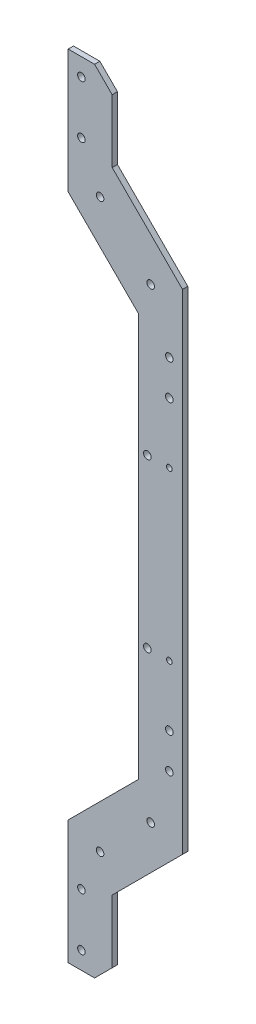
ISO-10303-21;
HEADER;
FILE_DESCRIPTION(('STEP AP214'),'2;1');
FILE_NAME('part.step','',(''),(''),'','','');
FILE_SCHEMA(('AUTOMOTIVE_DESIGN { 1 0 10303 214 1 1 1 1 }'));
ENDSEC;
DATA;
#1=APPLICATION_CONTEXT('core data for automotive mechanical design processes');
#2=APPLICATION_PROTOCOL_DEFINITION('international standard','automotive_design',2000,#1);
#3=PRODUCT_CONTEXT('',#1,'mechanical');
#4=PRODUCT('Part','Part','',(#3));
#5=PRODUCT_RELATED_PRODUCT_CATEGORY('part','',(#4));
#6=PRODUCT_DEFINITION_FORMATION('','',#4);
#7=PRODUCT_DEFINITION_CONTEXT('part definition',#1,'design');
#8=PRODUCT_DEFINITION('design','',#6,#7);
#9=PRODUCT_DEFINITION_SHAPE('','',#8);
#10=(LENGTH_UNIT() NAMED_UNIT(*) SI_UNIT(.MILLI.,.METRE.));
#11=(NAMED_UNIT(*) PLANE_ANGLE_UNIT() SI_UNIT($,.RADIAN.));
#12=(NAMED_UNIT(*) SI_UNIT($,.STERADIAN.) SOLID_ANGLE_UNIT());
#13=UNCERTAINTY_MEASURE_WITH_UNIT(LENGTH_MEASURE(1.E-05),#10,'distance_accuracy_value','');
#14=(GEOMETRIC_REPRESENTATION_CONTEXT(3) GLOBAL_UNCERTAINTY_ASSIGNED_CONTEXT((#13)) GLOBAL_UNIT_ASSIGNED_CONTEXT((#10,
#11,#12)) REPRESENTATION_CONTEXT('',''));
#15=CARTESIAN_POINT('',(0.,0.,0.));
#16=DIRECTION('',(0.,0.,1.));
#17=DIRECTION('',(1.,0.,0.));
#18=AXIS2_PLACEMENT_3D('',#15,#16,#17);
#19=CARTESIAN_POINT('',(0.,-224.999999999947,3.));
#20=DIRECTION('',(0.,1.,0.));
#21=DIRECTION('',(0.,0.,1.));
#22=AXIS2_PLACEMENT_3D('',#19,#20,#21);
#23=PLANE('',#22);
#24=DIRECTION('',(1.,0.,0.));
#25=VECTOR('',#24,1.);
#26=CARTESIAN_POINT('',(0.,-224.999999999947,0.));
#27=LINE('',#26,#25);
#28=CARTESIAN_POINT('',(-372.700177836843,-224.999999999947,0.));
#29=VERTEX_POINT('',#28);
#30=CARTESIAN_POINT('',(-357.700177836843,-224.999999999947,0.));
#31=VERTEX_POINT('',#30);
#32=EDGE_CURVE('E150',#29,#31,#27,.T.);
#33=ORIENTED_EDGE('',*,*,#32,.T.);
#34=DIRECTION('',(0.,0.,1.));
#35=VECTOR('',#34,1.);
#36=CARTESIAN_POINT('',(-357.700177836843,-224.999999999947,3.));
#37=LINE('',#36,#35);
#38=CARTESIAN_POINT('',(-357.700177836843,-224.999999999947,3.));
#39=VERTEX_POINT('',#38);
#40=EDGE_CURVE('E250',#31,#39,#37,.T.);
#41=ORIENTED_EDGE('',*,*,#40,.T.);
#42=DIRECTION('',(1.,0.,0.));
#43=VECTOR('',#42,1.);
#44=CARTESIAN_POINT('',(0.,-224.999999999947,3.));
#45=LINE('',#44,#43);
#46=CARTESIAN_POINT('',(-372.700177836843,-224.999999999947,3.));
#47=VERTEX_POINT('',#46);
#48=EDGE_CURVE('E154',#47,#39,#45,.T.);
#49=ORIENTED_EDGE('',*,*,#48,.F.);
#50=DIRECTION('',(0.,0.,-1.));
#51=VECTOR('',#50,1.);
#52=CARTESIAN_POINT('',(-372.700177836843,-224.999999999947,3.));
#53=LINE('',#52,#51);
#54=EDGE_CURVE('E209',#47,#29,#53,.T.);
#55=ORIENTED_EDGE('',*,*,#54,.T.);
#56=EDGE_LOOP('',(#33,#41,#49,#55));
#57=FACE_BOUND('',#56,.T.);
#58=ADVANCED_FACE('F40',(#57),#23,.F.);
#59=CARTESIAN_POINT('',(-347.700177836843,-4.20892630251318E-13,3.));
#60=DIRECTION('',(-1.,0.,0.));
#61=DIRECTION('',(0.,-1.,0.));
#62=AXIS2_PLACEMENT_3D('',#59,#60,#61);
#63=PLANE('',#62);
#64=DIRECTION('',(0.,1.,0.));
#65=VECTOR('',#64,1.);
#66=CARTESIAN_POINT('',(-347.700177836843,-4.20892630251318E-13,3.));
#67=LINE('',#66,#65);
#68=CARTESIAN_POINT('',(-347.700177836843,-214.999999999947,3.));
#69=VERTEX_POINT('',#68);
#70=CARTESIAN_POINT('',(-347.700177836843,-179.142135623678,3.));
#71=VERTEX_POINT('',#70);
#72=EDGE_CURVE('E190',#69,#71,#67,.T.);
#73=ORIENTED_EDGE('',*,*,#72,.F.);
#74=DIRECTION('',(0.,0.,-1.));
#75=VECTOR('',#74,1.);
#76=CARTESIAN_POINT('',(-347.700177836843,-214.999999999947,3.));
#77=LINE('',#76,#75);
#78=CARTESIAN_POINT('',(-347.700177836843,-214.999999999947,0.));
#79=VERTEX_POINT('',#78);
#80=EDGE_CURVE('E243',#69,#79,#77,.T.);
#81=ORIENTED_EDGE('',*,*,#80,.T.);
#82=DIRECTION('',(0.,1.,0.));
#83=VECTOR('',#82,1.);
#84=CARTESIAN_POINT('',(-347.700177836843,-4.20892630251318E-13,0.));
#85=LINE('',#84,#83);
#86=CARTESIAN_POINT('',(-347.700177836843,-179.142135623678,0.));
#87=VERTEX_POINT('',#86);
#88=EDGE_CURVE('E211',#79,#87,#85,.T.);
#89=ORIENTED_EDGE('',*,*,#88,.T.);
#90=DIRECTION('',(0.,0.,-1.));
#91=VECTOR('',#90,1.);
#92=CARTESIAN_POINT('',(-347.700177836843,-179.142135623678,3.));
#93=LINE('',#92,#91);
#94=EDGE_CURVE('E240',#71,#87,#93,.T.);
#95=ORIENTED_EDGE('',*,*,#94,.F.);
#96=EDGE_LOOP('',(#73,#81,#89,#95));
#97=FACE_BOUND('',#96,.T.);
#98=ADVANCED_FACE('F289',(#97),#63,.F.);
#99=CARTESIAN_POINT('',(-84.279021106582,84.2790211065823,3.));
#100=DIRECTION('',(-0.707106781186546,0.707106781186548,0.));
#101=DIRECTION('',(-0.707106781186549,-0.707106781186546,0.));
#102=AXIS2_PLACEMENT_3D('',#99,#100,#101);
#103=PLANE('',#102);
#104=DIRECTION('',(0.707106781186549,0.707106781186546,0.));
#105=VECTOR('',#104,1.);
#106=CARTESIAN_POINT('',(-84.279021106582,84.2790211065823,0.));
#107=LINE('',#106,#105);
#108=CARTESIAN_POINT('',(-307.700177836843,-139.142135623678,0.));
#109=VERTEX_POINT('',#108);
#110=EDGE_CURVE('E213',#87,#109,#107,.T.);
#111=ORIENTED_EDGE('',*,*,#110,.T.);
#112=DIRECTION('',(0.,0.,-1.));
#113=VECTOR('',#112,1.);
#114=CARTESIAN_POINT('',(-307.700177836843,-139.142135623678,3.));
#115=LINE('',#114,#113);
#116=CARTESIAN_POINT('',(-307.700177836843,-139.142135623678,3.));
#117=VERTEX_POINT('',#116);
#118=EDGE_CURVE('E237',#117,#109,#115,.T.);
#119=ORIENTED_EDGE('',*,*,#118,.F.);
#120=DIRECTION('',(0.707106781186549,0.707106781186546,0.));
#121=VECTOR('',#120,1.);
#122=CARTESIAN_POINT('',(-84.279021106582,84.2790211065823,3.));
#123=LINE('',#122,#121);
#124=EDGE_CURVE('E192',#71,#117,#123,.T.);
#125=ORIENTED_EDGE('',*,*,#124,.F.);
#126=ORIENTED_EDGE('',*,*,#94,.T.);
#127=EDGE_LOOP('',(#111,#119,#125,#126));
#128=FACE_BOUND('',#127,.T.);
#129=ADVANCED_FACE('F295',(#128),#103,.F.);
#130=CARTESIAN_POINT('',(-307.700177836842,2.41558864378642E-12,3.));
#131=DIRECTION('',(-1.,0.,0.));
#132=DIRECTION('',(0.,-1.,0.));
#133=AXIS2_PLACEMENT_3D('',#130,#131,#132);
#134=PLANE('',#133);
#135=DIRECTION('',(0.,1.,0.));
#136=VECTOR('',#135,1.);
#137=CARTESIAN_POINT('',(-307.700177836842,2.41558864378642E-12,0.));
#138=LINE('',#137,#136);
#139=CARTESIAN_POINT('',(-307.700177836843,139.142135623678,0.));
#140=VERTEX_POINT('',#139);
#141=EDGE_CURVE('E215',#109,#140,#138,.T.);
#142=ORIENTED_EDGE('',*,*,#141,.T.);
#143=DIRECTION('',(0.,0.,-1.));
#144=VECTOR('',#143,1.);
#145=CARTESIAN_POINT('',(-307.700177836843,139.142135623678,3.));
#146=LINE('',#145,#144);
#147=CARTESIAN_POINT('',(-307.700177836843,139.142135623678,3.));
#148=VERTEX_POINT('',#147);
#149=EDGE_CURVE('E235',#148,#140,#146,.T.);
#150=ORIENTED_EDGE('',*,*,#149,.F.);
#151=DIRECTION('',(0.,1.,0.));
#152=VECTOR('',#151,1.);
#153=CARTESIAN_POINT('',(-307.700177836842,2.41558864378642E-12,3.));
#154=LINE('',#153,#152);
#155=EDGE_CURVE('E194',#117,#148,#154,.T.);
#156=ORIENTED_EDGE('',*,*,#155,.F.);
#157=ORIENTED_EDGE('',*,*,#118,.T.);
#158=EDGE_LOOP('',(#142,#150,#156,#157));
#159=FACE_BOUND('',#158,.T.);
#160=ADVANCED_FACE('F325',(#159),#134,.F.);
#161=CARTESIAN_POINT('',(-84.279021106582,-84.2790211065823,3.));
#162=DIRECTION('',(0.707106781186546,0.707106781186548,0.));
#163=DIRECTION('',(-0.707106781186549,0.707106781186546,0.));
#164=AXIS2_PLACEMENT_3D('',#161,#162,#163);
#165=PLANE('',#164);
#166=DIRECTION('',(0.707106781186549,-0.707106781186546,0.));
#167=VECTOR('',#166,1.);
#168=CARTESIAN_POINT('',(-84.279021106582,-84.2790211065823,0.));
#169=LINE('',#168,#167);
#170=CARTESIAN_POINT('',(-347.700177836843,179.142135623678,0.));
#171=VERTEX_POINT('',#170);
#172=EDGE_CURVE('E218',#171,#140,#169,.T.);
#173=ORIENTED_EDGE('',*,*,#172,.F.);
#174=DIRECTION('',(0.,0.,-1.));
#175=VECTOR('',#174,1.);
#176=CARTESIAN_POINT('',(-347.700177836843,179.142135623678,3.));
#177=LINE('',#176,#175);
#178=CARTESIAN_POINT('',(-347.700177836843,179.142135623678,3.));
#179=VERTEX_POINT('',#178);
#180=EDGE_CURVE('E232',#179,#171,#177,.T.);
#181=ORIENTED_EDGE('',*,*,#180,.F.);
#182=DIRECTION('',(0.707106781186549,-0.707106781186546,0.));
#183=VECTOR('',#182,1.);
#184=CARTESIAN_POINT('',(-84.279021106582,-84.2790211065823,3.));
#185=LINE('',#184,#183);
#186=EDGE_CURVE('E196',#179,#148,#185,.T.);
#187=ORIENTED_EDGE('',*,*,#186,.T.);
#188=ORIENTED_EDGE('',*,*,#149,.T.);
#189=EDGE_LOOP('',(#173,#181,#187,#188));
#190=FACE_BOUND('',#189,.T.);
#191=ADVANCED_FACE('F330',(#190),#165,.T.);
#192=CARTESIAN_POINT('',(-347.700177836843,8.4178526050264E-13,3.));
#193=DIRECTION('',(1.,0.,0.));
#194=DIRECTION('',(0.,1.,0.));
#195=AXIS2_PLACEMENT_3D('',#192,#193,#194);
#196=PLANE('',#195);
#197=DIRECTION('',(0.,-1.,0.));
#198=VECTOR('',#197,1.);
#199=CARTESIAN_POINT('',(-347.700177836843,8.4178526050264E-13,0.));
#200=LINE('',#199,#198);
#201=CARTESIAN_POINT('',(-347.700177836843,214.999999999947,0.));
#202=VERTEX_POINT('',#201);
#203=EDGE_CURVE('E221',#202,#171,#200,.T.);
#204=ORIENTED_EDGE('',*,*,#203,.F.);
#205=DIRECTION('',(0.,0.,1.));
#206=VECTOR('',#205,1.);
#207=CARTESIAN_POINT('',(-347.700177836843,214.999999999947,3.));
#208=LINE('',#207,#206);
#209=CARTESIAN_POINT('',(-347.700177836843,214.999999999947,3.));
#210=VERTEX_POINT('',#209);
#211=EDGE_CURVE('E11',#202,#210,#208,.T.);
#212=ORIENTED_EDGE('',*,*,#211,.T.);
#213=DIRECTION('',(0.,-1.,0.));
#214=VECTOR('',#213,1.);
#215=CARTESIAN_POINT('',(-347.700177836843,8.4178526050264E-13,3.));
#216=LINE('',#215,#214);
#217=EDGE_CURVE('E199',#210,#179,#216,.T.);
#218=ORIENTED_EDGE('',*,*,#217,.T.);
#219=ORIENTED_EDGE('',*,*,#180,.T.);
#220=EDGE_LOOP('',(#204,#212,#218,#219));
#221=FACE_BOUND('',#220,.T.);
#222=ADVANCED_FACE('F331',(#221),#196,.T.);
#223=CARTESIAN_POINT('',(0.,224.999999999947,3.));
#224=DIRECTION('',(0.,1.,0.));
#225=DIRECTION('',(0.,0.,1.));
#226=AXIS2_PLACEMENT_3D('',#223,#224,#225);
#227=PLANE('',#226);
#228=DIRECTION('',(1.,0.,0.));
#229=VECTOR('',#228,1.);
#230=CARTESIAN_POINT('',(0.,224.999999999947,3.));
#231=LINE('',#230,#229);
#232=CARTESIAN_POINT('',(-372.700177836843,224.999999999947,3.));
#233=VERTEX_POINT('',#232);
#234=CARTESIAN_POINT('',(-357.700177836843,224.999999999947,3.));
#235=VERTEX_POINT('',#234);
#236=EDGE_CURVE('E201',#233,#235,#231,.T.);
#237=ORIENTED_EDGE('',*,*,#236,.T.);
#238=DIRECTION('',(0.,0.,-1.));
#239=VECTOR('',#238,1.);
#240=CARTESIAN_POINT('',(-357.700177836843,224.999999999947,3.));
#241=LINE('',#240,#239);
#242=CARTESIAN_POINT('',(-357.700177836843,224.999999999947,0.));
#243=VERTEX_POINT('',#242);
#244=EDGE_CURVE('E49',#235,#243,#241,.T.);
#245=ORIENTED_EDGE('',*,*,#244,.T.);
#246=DIRECTION('',(1.,0.,0.));
#247=VECTOR('',#246,1.);
#248=CARTESIAN_POINT('',(0.,224.999999999947,0.));
#249=LINE('',#248,#247);
#250=CARTESIAN_POINT('',(-372.700177836843,224.999999999947,0.));
#251=VERTEX_POINT('',#250);
#252=EDGE_CURVE('E223',#251,#243,#249,.T.);
#253=ORIENTED_EDGE('',*,*,#252,.F.);
#254=DIRECTION('',(0.,0.,-1.));
#255=VECTOR('',#254,1.);
#256=CARTESIAN_POINT('',(-372.700177836843,224.999999999947,3.));
#257=LINE('',#256,#255);
#258=EDGE_CURVE('E230',#233,#251,#257,.T.);
#259=ORIENTED_EDGE('',*,*,#258,.F.);
#260=EDGE_LOOP('',(#237,#245,#253,#259));
#261=FACE_BOUND('',#260,.T.);
#262=ADVANCED_FACE('F335',(#261),#227,.T.);
#263=CARTESIAN_POINT('',(-372.700177836843,0.,3.));
#264=DIRECTION('',(1.,0.,0.));
#265=DIRECTION('',(0.,0.,-1.));
#266=AXIS2_PLACEMENT_3D('',#263,#264,#265);
#267=PLANE('',#266);
#268=DIRECTION('',(0.,-1.,0.));
#269=VECTOR('',#268,1.);
#270=CARTESIAN_POINT('',(-372.700177836843,0.,0.));
#271=LINE('',#270,#269);
#272=CARTESIAN_POINT('',(-372.700177836843,154.64466094062,0.));
#273=VERTEX_POINT('',#272);
#274=EDGE_CURVE('E226',#251,#273,#271,.T.);
#275=ORIENTED_EDGE('',*,*,#274,.T.);
#276=DIRECTION('',(0.,0.,1.));
#277=VECTOR('',#276,1.);
#278=CARTESIAN_POINT('',(-372.700177836843,154.64466094062,0.));
#279=LINE('',#278,#277);
#280=CARTESIAN_POINT('',(-372.700177836843,154.64466094062,3.));
#281=VERTEX_POINT('',#280);
#282=EDGE_CURVE('E180',#273,#281,#279,.T.);
#283=ORIENTED_EDGE('',*,*,#282,.T.);
#284=DIRECTION('',(0.,-1.,0.));
#285=VECTOR('',#284,1.);
#286=CARTESIAN_POINT('',(-372.700177836843,0.,3.));
#287=LINE('',#286,#285);
#288=EDGE_CURVE('E203',#233,#281,#287,.T.);
#289=ORIENTED_EDGE('',*,*,#288,.F.);
#290=ORIENTED_EDGE('',*,*,#258,.T.);
#291=EDGE_LOOP('',(#275,#283,#289,#290));
#292=FACE_BOUND('',#291,.T.);
#293=ADVANCED_FACE('F340',(#292),#267,.F.);
#294=CARTESIAN_POINT('',(-332.700177836843,0.,3.));
#295=DIRECTION('',(1.,0.,0.));
#296=DIRECTION('',(0.,1.,0.));
#297=AXIS2_PLACEMENT_3D('',#294,#295,#296);
#298=PLANE('',#297);
#299=DIRECTION('',(0.,-1.,0.));
#300=VECTOR('',#299,1.);
#301=CARTESIAN_POINT('',(-332.700177836843,0.,0.));
#302=LINE('',#301,#300);
#303=CARTESIAN_POINT('',(-332.700177836843,114.64466094062,0.));
#304=VERTEX_POINT('',#303);
#305=CARTESIAN_POINT('',(-332.700177836843,-114.64466094062,0.));
#306=VERTEX_POINT('',#305);
#307=EDGE_CURVE('E155',#304,#306,#302,.T.);
#308=ORIENTED_EDGE('',*,*,#307,.T.);
#309=DIRECTION('',(0.,0.,1.));
#310=VECTOR('',#309,1.);
#311=CARTESIAN_POINT('',(-332.700177836843,-114.64466094062,0.));
#312=LINE('',#311,#310);
#313=CARTESIAN_POINT('',(-332.700177836843,-114.64466094062,3.));
#314=VERTEX_POINT('',#313);
#315=EDGE_CURVE('E165',#306,#314,#312,.T.);
#316=ORIENTED_EDGE('',*,*,#315,.T.);
#317=DIRECTION('',(0.,-1.,0.));
#318=VECTOR('',#317,1.);
#319=CARTESIAN_POINT('',(-332.700177836843,0.,3.));
#320=LINE('',#319,#318);
#321=CARTESIAN_POINT('',(-332.700177836843,114.64466094062,3.));
#322=VERTEX_POINT('',#321);
#323=EDGE_CURVE('E205',#322,#314,#320,.T.);
#324=ORIENTED_EDGE('',*,*,#323,.F.);
#325=DIRECTION('',(0.,0.,1.));
#326=VECTOR('',#325,1.);
#327=CARTESIAN_POINT('',(-332.700177836843,114.64466094062,0.));
#328=LINE('',#327,#326);
#329=EDGE_CURVE('E183',#304,#322,#328,.T.);
#330=ORIENTED_EDGE('',*,*,#329,.F.);
#331=EDGE_LOOP('',(#308,#316,#324,#330));
#332=FACE_BOUND('',#331,.T.);
#333=ADVANCED_FACE('F346',(#332),#298,.F.);
#334=CARTESIAN_POINT('',(-372.700177836843,3.68045488806221E-13,3.));
#335=DIRECTION('',(1.,0.,0.));
#336=DIRECTION('',(0.,1.,0.));
#337=AXIS2_PLACEMENT_3D('',#334,#335,#336);
#338=PLANE('',#337);
#339=DIRECTION('',(0.,-1.,0.));
#340=VECTOR('',#339,1.);
#341=CARTESIAN_POINT('',(-372.700177836843,3.68045488806221E-13,0.));
#342=LINE('',#341,#340);
#343=CARTESIAN_POINT('',(-372.700177836843,-154.64466094062,0.));
#344=VERTEX_POINT('',#343);
#345=EDGE_CURVE('E143',#344,#29,#342,.T.);
#346=ORIENTED_EDGE('',*,*,#345,.T.);
#347=ORIENTED_EDGE('',*,*,#54,.F.);
#348=DIRECTION('',(0.,-1.,0.));
#349=VECTOR('',#348,1.);
#350=CARTESIAN_POINT('',(-372.700177836843,3.68045488806221E-13,3.));
#351=LINE('',#350,#349);
#352=CARTESIAN_POINT('',(-372.700177836843,-154.64466094062,3.));
#353=VERTEX_POINT('',#352);
#354=EDGE_CURVE('E160',#353,#47,#351,.T.);
#355=ORIENTED_EDGE('',*,*,#354,.F.);
#356=DIRECTION('',(0.,0.,1.));
#357=VECTOR('',#356,1.);
#358=CARTESIAN_POINT('',(-372.700177836843,-154.64466094062,0.));
#359=LINE('',#358,#357);
#360=EDGE_CURVE('E158',#344,#353,#359,.T.);
#361=ORIENTED_EDGE('',*,*,#360,.F.);
#362=EDGE_LOOP('',(#346,#347,#355,#361));
#363=FACE_BOUND('',#362,.T.);
#364=ADVANCED_FACE('F159',(#363),#338,.F.);
#365=CARTESIAN_POINT('',(0.,0.,3.));
#366=DIRECTION('',(0.,0.,1.));
#367=DIRECTION('',(1.,0.,0.));
#368=AXIS2_PLACEMENT_3D('',#365,#366,#367);
#369=PLANE('',#368);
#370=CARTESIAN_POINT('',(-365.200177836843,214.999999999947,3.));
#371=DIRECTION('',(0.,0.,1.));
#372=DIRECTION('',(1.,0.,0.));
#373=AXIS2_PLACEMENT_3D('',#370,#371,#372);
#374=CIRCLE('',#373,2.14999999999996);
#375=CARTESIAN_POINT('',(-363.050177836843,214.999999999947,3.));
#376=VERTEX_POINT('',#375);
#377=EDGE_CURVE('E613',#376,#376,#374,.T.);
#378=ORIENTED_EDGE('',*,*,#377,.F.);
#379=EDGE_LOOP('',(#378));
#380=FACE_BOUND('',#379,.T.);
#381=CARTESIAN_POINT('',(-365.200177836843,184.999999999947,3.));
#382=DIRECTION('',(0.,0.,1.));
#383=DIRECTION('',(1.,0.,0.));
#384=AXIS2_PLACEMENT_3D('',#381,#382,#383);
#385=CIRCLE('',#384,2.14999999999996);
#386=CARTESIAN_POINT('',(-363.050177836843,184.999999999947,3.));
#387=VERTEX_POINT('',#386);
#388=EDGE_CURVE('E683',#387,#387,#385,.T.);
#389=ORIENTED_EDGE('',*,*,#388,.F.);
#390=EDGE_LOOP('',(#389));
#391=FACE_BOUND('',#390,.T.);
#392=CARTESIAN_POINT('',(-354.593576119045,161.28679656435,3.));
#393=DIRECTION('',(0.,0.,1.));
#394=DIRECTION('',(1.,0.,0.));
#395=AXIS2_PLACEMENT_3D('',#392,#393,#394);
#396=CIRCLE('',#395,2.14999999999996);
#397=CARTESIAN_POINT('',(-352.443576119045,161.28679656435,3.));
#398=VERTEX_POINT('',#397);
#399=EDGE_CURVE('E680',#398,#398,#396,.T.);
#400=ORIENTED_EDGE('',*,*,#399,.F.);
#401=EDGE_LOOP('',(#400));
#402=FACE_BOUND('',#401,.T.);
#403=CARTESIAN_POINT('',(-325.806779554641,132.499999999947,3.));
#404=DIRECTION('',(0.,0.,1.));
#405=DIRECTION('',(1.,0.,0.));
#406=AXIS2_PLACEMENT_3D('',#403,#404,#405);
#407=CIRCLE('',#406,2.14999999999996);
#408=CARTESIAN_POINT('',(-323.656779554641,132.499999999947,3.));
#409=VERTEX_POINT('',#408);
#410=EDGE_CURVE('E677',#409,#409,#407,.T.);
#411=ORIENTED_EDGE('',*,*,#410,.F.);
#412=EDGE_LOOP('',(#411));
#413=FACE_BOUND('',#412,.T.);
#414=CARTESIAN_POINT('',(-315.200177836843,101.893398282149,3.));
#415=DIRECTION('',(0.,0.,1.));
#416=DIRECTION('',(1.,0.,0.));
#417=AXIS2_PLACEMENT_3D('',#414,#415,#416);
#418=CIRCLE('',#417,2.14999999999996);
#419=CARTESIAN_POINT('',(-313.050177836843,101.893398282149,3.));
#420=VERTEX_POINT('',#419);
#421=EDGE_CURVE('E674',#420,#420,#418,.T.);
#422=ORIENTED_EDGE('',*,*,#421,.F.);
#423=EDGE_LOOP('',(#422));
#424=FACE_BOUND('',#423,.T.);
#425=CARTESIAN_POINT('',(-315.200177836843,81.8933982821488,3.));
#426=DIRECTION('',(0.,0.,1.));
#427=DIRECTION('',(1.,0.,0.));
#428=AXIS2_PLACEMENT_3D('',#425,#426,#427);
#429=CIRCLE('',#428,2.14999999999996);
#430=CARTESIAN_POINT('',(-313.050177836843,81.8933982821488,3.));
#431=VERTEX_POINT('',#430);
#432=EDGE_CURVE('E671',#431,#431,#429,.T.);
#433=ORIENTED_EDGE('',*,*,#432,.F.);
#434=EDGE_LOOP('',(#433));
#435=FACE_BOUND('',#434,.T.);
#436=CARTESIAN_POINT('',(-315.200177836843,-81.8933982821489,3.));
#437=DIRECTION('',(0.,0.,1.));
#438=DIRECTION('',(1.,0.,0.));
#439=AXIS2_PLACEMENT_3D('',#436,#437,#438);
#440=CIRCLE('',#439,2.14999999999997);
#441=CARTESIAN_POINT('',(-313.050177836843,-81.8933982821489,3.));
#442=VERTEX_POINT('',#441);
#443=EDGE_CURVE('E668',#442,#442,#440,.T.);
#444=ORIENTED_EDGE('',*,*,#443,.F.);
#445=EDGE_LOOP('',(#444));
#446=FACE_BOUND('',#445,.T.);
#447=CARTESIAN_POINT('',(-315.200177836843,-101.893398282149,3.));
#448=DIRECTION('',(0.,0.,1.));
#449=DIRECTION('',(1.,0.,0.));
#450=AXIS2_PLACEMENT_3D('',#447,#448,#449);
#451=CIRCLE('',#450,2.14999999999997);
#452=CARTESIAN_POINT('',(-313.050177836843,-101.893398282149,3.));
#453=VERTEX_POINT('',#452);
#454=EDGE_CURVE('E665',#453,#453,#451,.T.);
#455=ORIENTED_EDGE('',*,*,#454,.F.);
#456=EDGE_LOOP('',(#455));
#457=FACE_BOUND('',#456,.T.);
#458=CARTESIAN_POINT('',(-325.806779554641,-132.499999999947,3.));
#459=DIRECTION('',(0.,0.,1.));
#460=DIRECTION('',(1.,0.,0.));
#461=AXIS2_PLACEMENT_3D('',#458,#459,#460);
#462=CIRCLE('',#461,2.14999999999994);
#463=CARTESIAN_POINT('',(-323.656779554641,-132.499999999947,3.));
#464=VERTEX_POINT('',#463);
#465=EDGE_CURVE('E662',#464,#464,#462,.T.);
#466=ORIENTED_EDGE('',*,*,#465,.F.);
#467=EDGE_LOOP('',(#466));
#468=FACE_BOUND('',#467,.T.);
#469=CARTESIAN_POINT('',(-354.593576119044,-161.28679656435,3.));
#470=DIRECTION('',(0.,0.,1.));
#471=DIRECTION('',(1.,0.,0.));
#472=AXIS2_PLACEMENT_3D('',#469,#470,#471);
#473=CIRCLE('',#472,2.14999999999997);
#474=CARTESIAN_POINT('',(-352.443576119044,-161.28679656435,3.));
#475=VERTEX_POINT('',#474);
#476=EDGE_CURVE('E659',#475,#475,#473,.T.);
#477=ORIENTED_EDGE('',*,*,#476,.F.);
#478=EDGE_LOOP('',(#477));
#479=FACE_BOUND('',#478,.T.);
#480=CARTESIAN_POINT('',(-365.200177836843,-184.999999999947,3.));
#481=DIRECTION('',(0.,0.,1.));
#482=DIRECTION('',(1.,0.,0.));
#483=AXIS2_PLACEMENT_3D('',#480,#481,#482);
#484=CIRCLE('',#483,2.14999999999997);
#485=CARTESIAN_POINT('',(-363.050177836843,-184.999999999947,3.));
#486=VERTEX_POINT('',#485);
#487=EDGE_CURVE('E622',#486,#486,#484,.T.);
#488=ORIENTED_EDGE('',*,*,#487,.F.);
#489=EDGE_LOOP('',(#488));
#490=FACE_BOUND('',#489,.T.);
#491=CARTESIAN_POINT('',(-365.200177836843,-214.999999999947,3.));
#492=DIRECTION('',(0.,0.,1.));
#493=DIRECTION('',(1.,0.,0.));
#494=AXIS2_PLACEMENT_3D('',#491,#492,#493);
#495=CIRCLE('',#494,2.14999999999994);
#496=CARTESIAN_POINT('',(-363.050177836843,-214.999999999947,3.));
#497=VERTEX_POINT('',#496);
#498=EDGE_CURVE('E618',#497,#497,#495,.T.);
#499=ORIENTED_EDGE('',*,*,#498,.F.);
#500=EDGE_LOOP('',(#499));
#501=FACE_BOUND('',#500,.T.);
#502=CARTESIAN_POINT('',(-315.200177836843,47.4999999997968,3.));
#503=DIRECTION('',(0.,0.,1.));
#504=DIRECTION('',(1.,0.,0.));
#505=AXIS2_PLACEMENT_3D('',#502,#503,#504);
#506=CIRCLE('',#505,1.60000000000077);
#507=CARTESIAN_POINT('',(-313.600177836842,47.4999999997968,3.));
#508=VERTEX_POINT('',#507);
#509=EDGE_CURVE('E691',#508,#508,#506,.T.);
#510=ORIENTED_EDGE('',*,*,#509,.F.);
#511=EDGE_LOOP('',(#510));
#512=FACE_BOUND('',#511,.T.);
#513=CARTESIAN_POINT('',(-327.700177836784,-47.500000000134,3.));
#514=DIRECTION('',(0.,0.,1.));
#515=DIRECTION('',(1.,0.,0.));
#516=AXIS2_PLACEMENT_3D('',#513,#514,#515);
#517=CIRCLE('',#516,2.15000000000007);
#518=CARTESIAN_POINT('',(-325.550177836784,-47.500000000134,3.));
#519=VERTEX_POINT('',#518);
#520=EDGE_CURVE('E690',#519,#519,#517,.T.);
#521=ORIENTED_EDGE('',*,*,#520,.F.);
#522=EDGE_LOOP('',(#521));
#523=FACE_BOUND('',#522,.T.);
#524=CARTESIAN_POINT('',(-315.200177836843,-47.4999999999472,3.));
#525=DIRECTION('',(0.,0.,1.));
#526=DIRECTION('',(1.,0.,0.));
#527=AXIS2_PLACEMENT_3D('',#524,#525,#526);
#528=CIRCLE('',#527,1.60000000000484);
#529=CARTESIAN_POINT('',(-313.600177836838,-47.4999999999472,3.));
#530=VERTEX_POINT('',#529);
#531=EDGE_CURVE('E687',#530,#530,#528,.T.);
#532=ORIENTED_EDGE('',*,*,#531,.F.);
#533=EDGE_LOOP('',(#532));
#534=FACE_BOUND('',#533,.T.);
#535=CARTESIAN_POINT('',(-327.700177836806,47.4999999998662,3.));
#536=DIRECTION('',(0.,0.,1.));
#537=DIRECTION('',(1.,0.,0.));
#538=AXIS2_PLACEMENT_3D('',#535,#536,#537);
#539=CIRCLE('',#538,2.15000000000007);
#540=CARTESIAN_POINT('',(-325.550177836806,47.4999999998662,3.));
#541=VERTEX_POINT('',#540);
#542=EDGE_CURVE('E174',#541,#541,#539,.T.);
#543=ORIENTED_EDGE('',*,*,#542,.F.);
#544=EDGE_LOOP('',(#543));
#545=FACE_BOUND('',#544,.T.);
#546=ORIENTED_EDGE('',*,*,#48,.T.);
#547=DIRECTION('',(-0.707106781186548,-0.707106781186548,0.));
#548=VECTOR('',#547,1.);
#549=CARTESIAN_POINT('',(-66.3500889184479,66.3500889184479,3.));
#550=LINE('',#549,#548);
#551=EDGE_CURVE('E253',#39,#69,#550,.F.);
#552=ORIENTED_EDGE('',*,*,#551,.T.);
#553=ORIENTED_EDGE('',*,*,#72,.T.);
#554=ORIENTED_EDGE('',*,*,#124,.T.);
#555=ORIENTED_EDGE('',*,*,#155,.T.);
#556=ORIENTED_EDGE('',*,*,#186,.F.);
#557=ORIENTED_EDGE('',*,*,#217,.F.);
#558=DIRECTION('',(0.707106781186544,-0.707106781186551,0.));
#559=VECTOR('',#558,1.);
#560=CARTESIAN_POINT('',(-66.3500889184498,-66.3500889184491,3.));
#561=LINE('',#560,#559);
#562=EDGE_CURVE('E57',#210,#235,#561,.F.);
#563=ORIENTED_EDGE('',*,*,#562,.T.);
#564=ORIENTED_EDGE('',*,*,#236,.F.);
#565=ORIENTED_EDGE('',*,*,#288,.T.);
#566=DIRECTION('',(0.707106781186548,-0.707106781186547,0.));
#567=VECTOR('',#566,1.);
#568=CARTESIAN_POINT('',(-372.700177836843,154.64466094062,3.));
#569=LINE('',#568,#567);
#570=EDGE_CURVE('E164',#281,#322,#569,.T.);
#571=ORIENTED_EDGE('',*,*,#570,.T.);
#572=ORIENTED_EDGE('',*,*,#323,.T.);
#573=DIRECTION('',(-0.707106781186548,-0.707106781186548,0.));
#574=VECTOR('',#573,1.);
#575=CARTESIAN_POINT('',(-372.700177836843,-154.64466094062,3.));
#576=LINE('',#575,#574);
#577=EDGE_CURVE('E169',#314,#353,#576,.T.);
#578=ORIENTED_EDGE('',*,*,#577,.T.);
#579=ORIENTED_EDGE('',*,*,#354,.T.);
#580=EDGE_LOOP('',(#546,#552,#553,#554,#555,#556,#557,#563,#564,#565,#571,#572,#578,#579));
#581=FACE_BOUND('',#580,.T.);
#582=ADVANCED_FACE('F314',(#380,#391,#402,#413,#424,#435,#446,#457,#468,#479,#490,#501,#512,
#523,#534,#545,#581),#369,.T.);
#583=CARTESIAN_POINT('',(0.,0.,0.));
#584=DIRECTION('',(0.,0.,1.));
#585=DIRECTION('',(1.,0.,0.));
#586=AXIS2_PLACEMENT_3D('',#583,#584,#585);
#587=PLANE('',#586);
#588=CARTESIAN_POINT('',(-365.200177836843,214.999999999947,0.));
#589=DIRECTION('',(0.,0.,-1.));
#590=DIRECTION('',(-1.,0.,0.));
#591=AXIS2_PLACEMENT_3D('',#588,#589,#590);
#592=CIRCLE('',#591,2.14999999999996);
#593=CARTESIAN_POINT('',(-367.350177836843,214.999999999947,0.));
#594=VERTEX_POINT('',#593);
#595=EDGE_CURVE('E616',#594,#594,#592,.T.);
#596=ORIENTED_EDGE('',*,*,#595,.F.);
#597=EDGE_LOOP('',(#596));
#598=FACE_BOUND('',#597,.T.);
#599=CARTESIAN_POINT('',(-365.200177836843,184.999999999947,0.));
#600=DIRECTION('',(0.,0.,-1.));
#601=DIRECTION('',(-1.,0.,0.));
#602=AXIS2_PLACEMENT_3D('',#599,#600,#601);
#603=CIRCLE('',#602,2.14999999999996);
#604=CARTESIAN_POINT('',(-367.350177836843,184.999999999947,0.));
#605=VERTEX_POINT('',#604);
#606=EDGE_CURVE('E619',#605,#605,#603,.T.);
#607=ORIENTED_EDGE('',*,*,#606,.F.);
#608=EDGE_LOOP('',(#607));
#609=FACE_BOUND('',#608,.T.);
#610=CARTESIAN_POINT('',(-354.593576119045,161.28679656435,0.));
#611=DIRECTION('',(0.,0.,-1.));
#612=DIRECTION('',(-1.,0.,0.));
#613=AXIS2_PLACEMENT_3D('',#610,#611,#612);
#614=CIRCLE('',#613,2.14999999999996);
#615=CARTESIAN_POINT('',(-356.743576119045,161.28679656435,0.));
#616=VERTEX_POINT('',#615);
#617=EDGE_CURVE('E625',#616,#616,#614,.T.);
#618=ORIENTED_EDGE('',*,*,#617,.F.);
#619=EDGE_LOOP('',(#618));
#620=FACE_BOUND('',#619,.T.);
#621=CARTESIAN_POINT('',(-325.806779554641,132.499999999947,0.));
#622=DIRECTION('',(0.,0.,-1.));
#623=DIRECTION('',(-1.,0.,0.));
#624=AXIS2_PLACEMENT_3D('',#621,#622,#623);
#625=CIRCLE('',#624,2.14999999999996);
#626=CARTESIAN_POINT('',(-327.956779554641,132.499999999947,0.));
#627=VERTEX_POINT('',#626);
#628=EDGE_CURVE('E630',#627,#627,#625,.T.);
#629=ORIENTED_EDGE('',*,*,#628,.F.);
#630=EDGE_LOOP('',(#629));
#631=FACE_BOUND('',#630,.T.);
#632=CARTESIAN_POINT('',(-315.200177836843,101.893398282149,0.));
#633=DIRECTION('',(0.,0.,-1.));
#634=DIRECTION('',(-1.,0.,0.));
#635=AXIS2_PLACEMENT_3D('',#632,#633,#634);
#636=CIRCLE('',#635,2.14999999999996);
#637=CARTESIAN_POINT('',(-317.350177836843,101.893398282149,0.));
#638=VERTEX_POINT('',#637);
#639=EDGE_CURVE('E633',#638,#638,#636,.T.);
#640=ORIENTED_EDGE('',*,*,#639,.F.);
#641=EDGE_LOOP('',(#640));
#642=FACE_BOUND('',#641,.T.);
#643=CARTESIAN_POINT('',(-315.200177836843,81.8933982821488,0.));
#644=DIRECTION('',(0.,0.,-1.));
#645=DIRECTION('',(-1.,0.,0.));
#646=AXIS2_PLACEMENT_3D('',#643,#644,#645);
#647=CIRCLE('',#646,2.14999999999996);
#648=CARTESIAN_POINT('',(-317.350177836843,81.8933982821488,0.));
#649=VERTEX_POINT('',#648);
#650=EDGE_CURVE('E636',#649,#649,#647,.T.);
#651=ORIENTED_EDGE('',*,*,#650,.F.);
#652=EDGE_LOOP('',(#651));
#653=FACE_BOUND('',#652,.T.);
#654=CARTESIAN_POINT('',(-315.200177836843,-81.8933982821489,0.));
#655=DIRECTION('',(0.,0.,-1.));
#656=DIRECTION('',(1.,0.,0.));
#657=AXIS2_PLACEMENT_3D('',#654,#655,#656);
#658=CIRCLE('',#657,2.14999999999997);
#659=CARTESIAN_POINT('',(-313.050177836843,-81.8933982821489,0.));
#660=VERTEX_POINT('',#659);
#661=EDGE_CURVE('E639',#660,#660,#658,.T.);
#662=ORIENTED_EDGE('',*,*,#661,.F.);
#663=EDGE_LOOP('',(#662));
#664=FACE_BOUND('',#663,.T.);
#665=CARTESIAN_POINT('',(-315.200177836843,-101.893398282149,0.));
#666=DIRECTION('',(0.,0.,-1.));
#667=DIRECTION('',(1.,0.,0.));
#668=AXIS2_PLACEMENT_3D('',#665,#666,#667);
#669=CIRCLE('',#668,2.14999999999997);
#670=CARTESIAN_POINT('',(-313.050177836843,-101.893398282149,0.));
#671=VERTEX_POINT('',#670);
#672=EDGE_CURVE('E642',#671,#671,#669,.T.);
#673=ORIENTED_EDGE('',*,*,#672,.F.);
#674=EDGE_LOOP('',(#673));
#675=FACE_BOUND('',#674,.T.);
#676=CARTESIAN_POINT('',(-325.806779554641,-132.499999999947,0.));
#677=DIRECTION('',(0.,0.,-1.));
#678=DIRECTION('',(1.,0.,0.));
#679=AXIS2_PLACEMENT_3D('',#676,#677,#678);
#680=CIRCLE('',#679,2.14999999999994);
#681=CARTESIAN_POINT('',(-323.656779554641,-132.499999999947,0.));
#682=VERTEX_POINT('',#681);
#683=EDGE_CURVE('E645',#682,#682,#680,.T.);
#684=ORIENTED_EDGE('',*,*,#683,.F.);
#685=EDGE_LOOP('',(#684));
#686=FACE_BOUND('',#685,.T.);
#687=CARTESIAN_POINT('',(-354.593576119044,-161.28679656435,0.));
#688=DIRECTION('',(0.,0.,-1.));
#689=DIRECTION('',(1.,0.,0.));
#690=AXIS2_PLACEMENT_3D('',#687,#688,#689);
#691=CIRCLE('',#690,2.14999999999997);
#692=CARTESIAN_POINT('',(-352.443576119044,-161.28679656435,0.));
#693=VERTEX_POINT('',#692);
#694=EDGE_CURVE('E648',#693,#693,#691,.T.);
#695=ORIENTED_EDGE('',*,*,#694,.F.);
#696=EDGE_LOOP('',(#695));
#697=FACE_BOUND('',#696,.T.);
#698=CARTESIAN_POINT('',(-365.200177836843,-184.999999999947,0.));
#699=DIRECTION('',(0.,0.,-1.));
#700=DIRECTION('',(1.,0.,0.));
#701=AXIS2_PLACEMENT_3D('',#698,#699,#700);
#702=CIRCLE('',#701,2.14999999999997);
#703=CARTESIAN_POINT('',(-363.050177836843,-184.999999999947,0.));
#704=VERTEX_POINT('',#703);
#705=EDGE_CURVE('E651',#704,#704,#702,.T.);
#706=ORIENTED_EDGE('',*,*,#705,.F.);
#707=EDGE_LOOP('',(#706));
#708=FACE_BOUND('',#707,.T.);
#709=CARTESIAN_POINT('',(-365.200177836843,-214.999999999947,0.));
#710=DIRECTION('',(0.,0.,-1.));
#711=DIRECTION('',(1.,0.,0.));
#712=AXIS2_PLACEMENT_3D('',#709,#710,#711);
#713=CIRCLE('',#712,2.14999999999994);
#714=CARTESIAN_POINT('',(-363.050177836843,-214.999999999947,0.));
#715=VERTEX_POINT('',#714);
#716=EDGE_CURVE('E654',#715,#715,#713,.T.);
#717=ORIENTED_EDGE('',*,*,#716,.F.);
#718=EDGE_LOOP('',(#717));
#719=FACE_BOUND('',#718,.T.);
#720=CARTESIAN_POINT('',(-315.200177836843,47.4999999997968,0.));
#721=DIRECTION('',(0.,0.,1.));
#722=DIRECTION('',(1.,0.,0.));
#723=AXIS2_PLACEMENT_3D('',#720,#721,#722);
#724=CIRCLE('',#723,1.60000000000077);
#725=CARTESIAN_POINT('',(-313.600177836842,47.4999999997968,0.));
#726=VERTEX_POINT('',#725);
#727=EDGE_CURVE('E44',#726,#726,#724,.T.);
#728=ORIENTED_EDGE('',*,*,#727,.T.);
#729=EDGE_LOOP('',(#728));
#730=FACE_BOUND('',#729,.T.);
#731=CARTESIAN_POINT('',(-327.700177836784,-47.500000000134,0.));
#732=DIRECTION('',(0.,0.,1.));
#733=DIRECTION('',(1.,0.,0.));
#734=AXIS2_PLACEMENT_3D('',#731,#732,#733);
#735=CIRCLE('',#734,2.15000000000007);
#736=CARTESIAN_POINT('',(-325.550177836784,-47.500000000134,0.));
#737=VERTEX_POINT('',#736);
#738=EDGE_CURVE('E262',#737,#737,#735,.T.);
#739=ORIENTED_EDGE('',*,*,#738,.T.);
#740=EDGE_LOOP('',(#739));
#741=FACE_BOUND('',#740,.T.);
#742=CARTESIAN_POINT('',(-315.200177836843,-47.4999999999472,0.));
#743=DIRECTION('',(0.,0.,1.));
#744=DIRECTION('',(1.,0.,0.));
#745=AXIS2_PLACEMENT_3D('',#742,#743,#744);
#746=CIRCLE('',#745,1.60000000000484);
#747=CARTESIAN_POINT('',(-313.600177836838,-47.4999999999472,0.));
#748=VERTEX_POINT('',#747);
#749=EDGE_CURVE('E260',#748,#748,#746,.T.);
#750=ORIENTED_EDGE('',*,*,#749,.T.);
#751=EDGE_LOOP('',(#750));
#752=FACE_BOUND('',#751,.T.);
#753=CARTESIAN_POINT('',(-327.700177836806,47.4999999998662,0.));
#754=DIRECTION('',(0.,0.,1.));
#755=DIRECTION('',(1.,0.,0.));
#756=AXIS2_PLACEMENT_3D('',#753,#754,#755);
#757=CIRCLE('',#756,2.15000000000007);
#758=CARTESIAN_POINT('',(-325.550177836806,47.4999999998662,0.));
#759=VERTEX_POINT('',#758);
#760=EDGE_CURVE('E257',#759,#759,#757,.T.);
#761=ORIENTED_EDGE('',*,*,#760,.T.);
#762=EDGE_LOOP('',(#761));
#763=FACE_BOUND('',#762,.T.);
#764=ORIENTED_EDGE('',*,*,#88,.F.);
#765=DIRECTION('',(0.707106781186548,0.707106781186548,0.));
#766=VECTOR('',#765,1.);
#767=CARTESIAN_POINT('',(-347.700177836843,-214.999999999947,0.));
#768=LINE('',#767,#766);
#769=EDGE_CURVE('E248',#79,#31,#768,.F.);
#770=ORIENTED_EDGE('',*,*,#769,.T.);
#771=ORIENTED_EDGE('',*,*,#32,.F.);
#772=ORIENTED_EDGE('',*,*,#345,.F.);
#773=DIRECTION('',(-0.707106781186548,-0.707106781186548,0.));
#774=VECTOR('',#773,1.);
#775=CARTESIAN_POINT('',(-372.700177836843,-154.64466094062,0.));
#776=LINE('',#775,#774);
#777=EDGE_CURVE('E148',#306,#344,#776,.T.);
#778=ORIENTED_EDGE('',*,*,#777,.F.);
#779=ORIENTED_EDGE('',*,*,#307,.F.);
#780=DIRECTION('',(0.707106781186548,-0.707106781186547,0.));
#781=VECTOR('',#780,1.);
#782=CARTESIAN_POINT('',(-372.700177836843,154.64466094062,0.));
#783=LINE('',#782,#781);
#784=EDGE_CURVE('E177',#273,#304,#783,.T.);
#785=ORIENTED_EDGE('',*,*,#784,.F.);
#786=ORIENTED_EDGE('',*,*,#274,.F.);
#787=ORIENTED_EDGE('',*,*,#252,.T.);
#788=DIRECTION('',(-0.707106781186544,0.707106781186551,0.));
#789=VECTOR('',#788,1.);
#790=CARTESIAN_POINT('',(-357.700177836843,224.999999999947,0.));
#791=LINE('',#790,#789);
#792=EDGE_CURVE('E246',#243,#202,#791,.F.);
#793=ORIENTED_EDGE('',*,*,#792,.T.);
#794=ORIENTED_EDGE('',*,*,#203,.T.);
#795=ORIENTED_EDGE('',*,*,#172,.T.);
#796=ORIENTED_EDGE('',*,*,#141,.F.);
#797=ORIENTED_EDGE('',*,*,#110,.F.);
#798=EDGE_LOOP('',(#764,#770,#771,#772,#778,#779,#785,#786,#787,#793,#794,#795,#796,#797));
#799=FACE_BOUND('',#798,.T.);
#800=ADVANCED_FACE('F146',(#598,#609,#620,#631,#642,#653,#664,#675,#686,#697,#708,#719,#730,
#741,#752,#763,#799),#587,.F.);
#801=CARTESIAN_POINT('',(-372.700177836843,154.64466094062,0.));
#802=DIRECTION('',(-0.707106781186547,-0.707106781186548,0.));
#803=DIRECTION('',(0.707106781186548,-0.707106781186547,0.));
#804=AXIS2_PLACEMENT_3D('',#801,#802,#803);
#805=PLANE('',#804);
#806=ORIENTED_EDGE('',*,*,#570,.F.);
#807=ORIENTED_EDGE('',*,*,#282,.F.);
#808=ORIENTED_EDGE('',*,*,#784,.T.);
#809=ORIENTED_EDGE('',*,*,#329,.T.);
#810=EDGE_LOOP('',(#806,#807,#808,#809));
#811=FACE_BOUND('',#810,.T.);
#812=ADVANCED_FACE('F308',(#811),#805,.T.);
#813=CARTESIAN_POINT('',(-372.700177836843,-154.64466094062,0.));
#814=DIRECTION('',(-0.707106781186547,0.707106781186547,0.));
#815=DIRECTION('',(-0.707106781186548,-0.707106781186548,0.));
#816=AXIS2_PLACEMENT_3D('',#813,#814,#815);
#817=PLANE('',#816);
#818=ORIENTED_EDGE('',*,*,#577,.F.);
#819=ORIENTED_EDGE('',*,*,#315,.F.);
#820=ORIENTED_EDGE('',*,*,#777,.T.);
#821=ORIENTED_EDGE('',*,*,#360,.T.);
#822=EDGE_LOOP('',(#818,#819,#820,#821));
#823=FACE_BOUND('',#822,.T.);
#824=ADVANCED_FACE('F168',(#823),#817,.T.);
#825=CARTESIAN_POINT('',(-347.700177836843,-214.999999999947,3.));
#826=DIRECTION('',(-0.707106781186547,0.707106781186547,0.));
#827=DIRECTION('',(0.,0.,-1.));
#828=AXIS2_PLACEMENT_3D('',#825,#826,#827);
#829=PLANE('',#828);
#830=ORIENTED_EDGE('',*,*,#551,.F.);
#831=ORIENTED_EDGE('',*,*,#40,.F.);
#832=ORIENTED_EDGE('',*,*,#769,.F.);
#833=ORIENTED_EDGE('',*,*,#80,.F.);
#834=EDGE_LOOP('',(#830,#831,#832,#833));
#835=FACE_BOUND('',#834,.T.);
#836=ADVANCED_FACE('F299',(#835),#829,.F.);
#837=CARTESIAN_POINT('',(-357.700177836843,224.999999999947,3.));
#838=DIRECTION('',(-0.707106781186551,-0.707106781186543,0.));
#839=DIRECTION('',(0.,0.,-1.));
#840=AXIS2_PLACEMENT_3D('',#837,#838,#839);
#841=PLANE('',#840);
#842=ORIENTED_EDGE('',*,*,#562,.F.);
#843=ORIENTED_EDGE('',*,*,#211,.F.);
#844=ORIENTED_EDGE('',*,*,#792,.F.);
#845=ORIENTED_EDGE('',*,*,#244,.F.);
#846=EDGE_LOOP('',(#842,#843,#844,#845));
#847=FACE_BOUND('',#846,.T.);
#848=ADVANCED_FACE('F42',(#847),#841,.F.);
#849=CARTESIAN_POINT('',(-327.700177836806,47.4999999998662,-7.));
#850=DIRECTION('',(0.,0.,1.));
#851=DIRECTION('',(1.,0.,0.));
#852=AXIS2_PLACEMENT_3D('',#849,#850,#851);
#853=CYLINDRICAL_SURFACE('',#852,2.15000000000007);
#854=ORIENTED_EDGE('',*,*,#542,.T.);
#855=EDGE_LOOP('',(#854));
#856=FACE_BOUND('',#855,.T.);
#857=ORIENTED_EDGE('',*,*,#760,.F.);
#858=EDGE_LOOP('',(#857));
#859=FACE_BOUND('',#858,.T.);
#860=ADVANCED_FACE('F306',(#856,#859),#853,.F.);
#861=CARTESIAN_POINT('',(-315.200177836843,-47.4999999999472,-7.));
#862=DIRECTION('',(0.,0.,1.));
#863=DIRECTION('',(1.,0.,0.));
#864=AXIS2_PLACEMENT_3D('',#861,#862,#863);
#865=CYLINDRICAL_SURFACE('',#864,1.60000000000484);
#866=ORIENTED_EDGE('',*,*,#531,.T.);
#867=EDGE_LOOP('',(#866));
#868=FACE_BOUND('',#867,.T.);
#869=ORIENTED_EDGE('',*,*,#749,.F.);
#870=EDGE_LOOP('',(#869));
#871=FACE_BOUND('',#870,.T.);
#872=ADVANCED_FACE('F283',(#868,#871),#865,.F.);
#873=CARTESIAN_POINT('',(-327.700177836784,-47.500000000134,-7.));
#874=DIRECTION('',(0.,0.,1.));
#875=DIRECTION('',(1.,0.,0.));
#876=AXIS2_PLACEMENT_3D('',#873,#874,#875);
#877=CYLINDRICAL_SURFACE('',#876,2.15000000000007);
#878=ORIENTED_EDGE('',*,*,#520,.T.);
#879=EDGE_LOOP('',(#878));
#880=FACE_BOUND('',#879,.T.);
#881=ORIENTED_EDGE('',*,*,#738,.F.);
#882=EDGE_LOOP('',(#881));
#883=FACE_BOUND('',#882,.T.);
#884=ADVANCED_FACE('F273',(#880,#883),#877,.F.);
#885=CARTESIAN_POINT('',(-315.200177836843,47.4999999997968,-7.));
#886=DIRECTION('',(0.,0.,1.));
#887=DIRECTION('',(1.,0.,0.));
#888=AXIS2_PLACEMENT_3D('',#885,#886,#887);
#889=CYLINDRICAL_SURFACE('',#888,1.60000000000077);
#890=ORIENTED_EDGE('',*,*,#509,.T.);
#891=EDGE_LOOP('',(#890));
#892=FACE_BOUND('',#891,.T.);
#893=ORIENTED_EDGE('',*,*,#727,.F.);
#894=EDGE_LOOP('',(#893));
#895=FACE_BOUND('',#894,.T.);
#896=ADVANCED_FACE('F270',(#892,#895),#889,.F.);
#897=CARTESIAN_POINT('',(-365.200177836843,-214.999999999947,10.));
#898=DIRECTION('',(0.,0.,-1.));
#899=DIRECTION('',(-1.,0.,0.));
#900=AXIS2_PLACEMENT_3D('',#897,#898,#899);
#901=CYLINDRICAL_SURFACE('',#900,2.14999999999994);
#902=ORIENTED_EDGE('',*,*,#498,.T.);
#903=EDGE_LOOP('',(#902));
#904=FACE_BOUND('',#903,.T.);
#905=ORIENTED_EDGE('',*,*,#716,.T.);
#906=EDGE_LOOP('',(#905));
#907=FACE_BOUND('',#906,.T.);
#908=ADVANCED_FACE('F272',(#904,#907),#901,.F.);
#909=CARTESIAN_POINT('',(-365.200177836843,-184.999999999947,10.));
#910=DIRECTION('',(0.,0.,-1.));
#911=DIRECTION('',(-1.,0.,0.));
#912=AXIS2_PLACEMENT_3D('',#909,#910,#911);
#913=CYLINDRICAL_SURFACE('',#912,2.14999999999997);
#914=ORIENTED_EDGE('',*,*,#487,.T.);
#915=EDGE_LOOP('',(#914));
#916=FACE_BOUND('',#915,.T.);
#917=ORIENTED_EDGE('',*,*,#705,.T.);
#918=EDGE_LOOP('',(#917));
#919=FACE_BOUND('',#918,.T.);
#920=ADVANCED_FACE('F280',(#916,#919),#913,.F.);
#921=CARTESIAN_POINT('',(-354.593576119044,-161.28679656435,10.));
#922=DIRECTION('',(0.,0.,-1.));
#923=DIRECTION('',(-1.,0.,0.));
#924=AXIS2_PLACEMENT_3D('',#921,#922,#923);
#925=CYLINDRICAL_SURFACE('',#924,2.14999999999997);
#926=ORIENTED_EDGE('',*,*,#476,.T.);
#927=EDGE_LOOP('',(#926));
#928=FACE_BOUND('',#927,.T.);
#929=ORIENTED_EDGE('',*,*,#694,.T.);
#930=EDGE_LOOP('',(#929));
#931=FACE_BOUND('',#930,.T.);
#932=ADVANCED_FACE('F506',(#928,#931),#925,.F.);
#933=CARTESIAN_POINT('',(-325.806779554641,-132.499999999947,10.));
#934=DIRECTION('',(0.,0.,-1.));
#935=DIRECTION('',(-1.,0.,0.));
#936=AXIS2_PLACEMENT_3D('',#933,#934,#935);
#937=CYLINDRICAL_SURFACE('',#936,2.14999999999994);
#938=ORIENTED_EDGE('',*,*,#465,.T.);
#939=EDGE_LOOP('',(#938));
#940=FACE_BOUND('',#939,.T.);
#941=ORIENTED_EDGE('',*,*,#683,.T.);
#942=EDGE_LOOP('',(#941));
#943=FACE_BOUND('',#942,.T.);
#944=ADVANCED_FACE('F515',(#940,#943),#937,.F.);
#945=CARTESIAN_POINT('',(-315.200177836843,-101.893398282149,10.));
#946=DIRECTION('',(0.,0.,-1.));
#947=DIRECTION('',(-1.,0.,0.));
#948=AXIS2_PLACEMENT_3D('',#945,#946,#947);
#949=CYLINDRICAL_SURFACE('',#948,2.14999999999997);
#950=ORIENTED_EDGE('',*,*,#454,.T.);
#951=EDGE_LOOP('',(#950));
#952=FACE_BOUND('',#951,.T.);
#953=ORIENTED_EDGE('',*,*,#672,.T.);
#954=EDGE_LOOP('',(#953));
#955=FACE_BOUND('',#954,.T.);
#956=ADVANCED_FACE('F524',(#952,#955),#949,.F.);
#957=CARTESIAN_POINT('',(-315.200177836843,-81.8933982821489,10.));
#958=DIRECTION('',(0.,0.,-1.));
#959=DIRECTION('',(-1.,0.,0.));
#960=AXIS2_PLACEMENT_3D('',#957,#958,#959);
#961=CYLINDRICAL_SURFACE('',#960,2.14999999999997);
#962=ORIENTED_EDGE('',*,*,#443,.T.);
#963=EDGE_LOOP('',(#962));
#964=FACE_BOUND('',#963,.T.);
#965=ORIENTED_EDGE('',*,*,#661,.T.);
#966=EDGE_LOOP('',(#965));
#967=FACE_BOUND('',#966,.T.);
#968=ADVANCED_FACE('F533',(#964,#967),#961,.F.);
#969=CARTESIAN_POINT('',(-315.200177836843,81.8933982821488,10.));
#970=DIRECTION('',(0.,0.,-1.));
#971=DIRECTION('',(-1.,0.,0.));
#972=AXIS2_PLACEMENT_3D('',#969,#970,#971);
#973=CYLINDRICAL_SURFACE('',#972,2.14999999999996);
#974=ORIENTED_EDGE('',*,*,#432,.T.);
#975=EDGE_LOOP('',(#974));
#976=FACE_BOUND('',#975,.T.);
#977=ORIENTED_EDGE('',*,*,#650,.T.);
#978=EDGE_LOOP('',(#977));
#979=FACE_BOUND('',#978,.T.);
#980=ADVANCED_FACE('F542',(#976,#979),#973,.F.);
#981=CARTESIAN_POINT('',(-315.200177836843,101.893398282149,10.));
#982=DIRECTION('',(0.,0.,-1.));
#983=DIRECTION('',(-1.,0.,0.));
#984=AXIS2_PLACEMENT_3D('',#981,#982,#983);
#985=CYLINDRICAL_SURFACE('',#984,2.14999999999996);
#986=ORIENTED_EDGE('',*,*,#421,.T.);
#987=EDGE_LOOP('',(#986));
#988=FACE_BOUND('',#987,.T.);
#989=ORIENTED_EDGE('',*,*,#639,.T.);
#990=EDGE_LOOP('',(#989));
#991=FACE_BOUND('',#990,.T.);
#992=ADVANCED_FACE('F551',(#988,#991),#985,.F.);
#993=CARTESIAN_POINT('',(-325.806779554641,132.499999999947,10.));
#994=DIRECTION('',(0.,0.,-1.));
#995=DIRECTION('',(-1.,0.,0.));
#996=AXIS2_PLACEMENT_3D('',#993,#994,#995);
#997=CYLINDRICAL_SURFACE('',#996,2.14999999999996);
#998=ORIENTED_EDGE('',*,*,#410,.T.);
#999=EDGE_LOOP('',(#998));
#1000=FACE_BOUND('',#999,.T.);
#1001=ORIENTED_EDGE('',*,*,#628,.T.);
#1002=EDGE_LOOP('',(#1001));
#1003=FACE_BOUND('',#1002,.T.);
#1004=ADVANCED_FACE('F560',(#1000,#1003),#997,.F.);
#1005=CARTESIAN_POINT('',(-354.593576119045,161.28679656435,10.));
#1006=DIRECTION('',(0.,0.,-1.));
#1007=DIRECTION('',(-1.,0.,0.));
#1008=AXIS2_PLACEMENT_3D('',#1005,#1006,#1007);
#1009=CYLINDRICAL_SURFACE('',#1008,2.14999999999996);
#1010=ORIENTED_EDGE('',*,*,#399,.T.);
#1011=EDGE_LOOP('',(#1010));
#1012=FACE_BOUND('',#1011,.T.);
#1013=ORIENTED_EDGE('',*,*,#617,.T.);
#1014=EDGE_LOOP('',(#1013));
#1015=FACE_BOUND('',#1014,.T.);
#1016=ADVANCED_FACE('F569',(#1012,#1015),#1009,.F.);
#1017=CARTESIAN_POINT('',(-365.200177836843,184.999999999947,10.));
#1018=DIRECTION('',(0.,0.,-1.));
#1019=DIRECTION('',(-1.,0.,0.));
#1020=AXIS2_PLACEMENT_3D('',#1017,#1018,#1019);
#1021=CYLINDRICAL_SURFACE('',#1020,2.14999999999996);
#1022=ORIENTED_EDGE('',*,*,#388,.T.);
#1023=EDGE_LOOP('',(#1022));
#1024=FACE_BOUND('',#1023,.T.);
#1025=ORIENTED_EDGE('',*,*,#606,.T.);
#1026=EDGE_LOOP('',(#1025));
#1027=FACE_BOUND('',#1026,.T.);
#1028=ADVANCED_FACE('F578',(#1024,#1027),#1021,.F.);
#1029=CARTESIAN_POINT('',(-365.200177836843,214.999999999947,10.));
#1030=DIRECTION('',(0.,0.,-1.));
#1031=DIRECTION('',(-1.,0.,0.));
#1032=AXIS2_PLACEMENT_3D('',#1029,#1030,#1031);
#1033=CYLINDRICAL_SURFACE('',#1032,2.14999999999996);
#1034=ORIENTED_EDGE('',*,*,#377,.T.);
#1035=EDGE_LOOP('',(#1034));
#1036=FACE_BOUND('',#1035,.T.);
#1037=ORIENTED_EDGE('',*,*,#595,.T.);
#1038=EDGE_LOOP('',(#1037));
#1039=FACE_BOUND('',#1038,.T.);
#1040=ADVANCED_FACE('F587',(#1036,#1039),#1033,.F.);
#1041=CLOSED_SHELL('',(#58,#98,#129,#160,#191,#222,#262,#293,#333,#364,#582,#800,#812,#824,#836,
#848,#860,#872,#884,#896,#908,#920,#932,#944,#956,#968,#980,#992,#1004,#1016,#1028,#1040));
#1042=MANIFOLD_SOLID_BREP('B2',#1041);
#1043=ADVANCED_BREP_SHAPE_REPRESENTATION('',(#18,#1042),#14);
#1044=SHAPE_DEFINITION_REPRESENTATION(#9,#1043);
ENDSEC;
END-ISO-10303-21;
